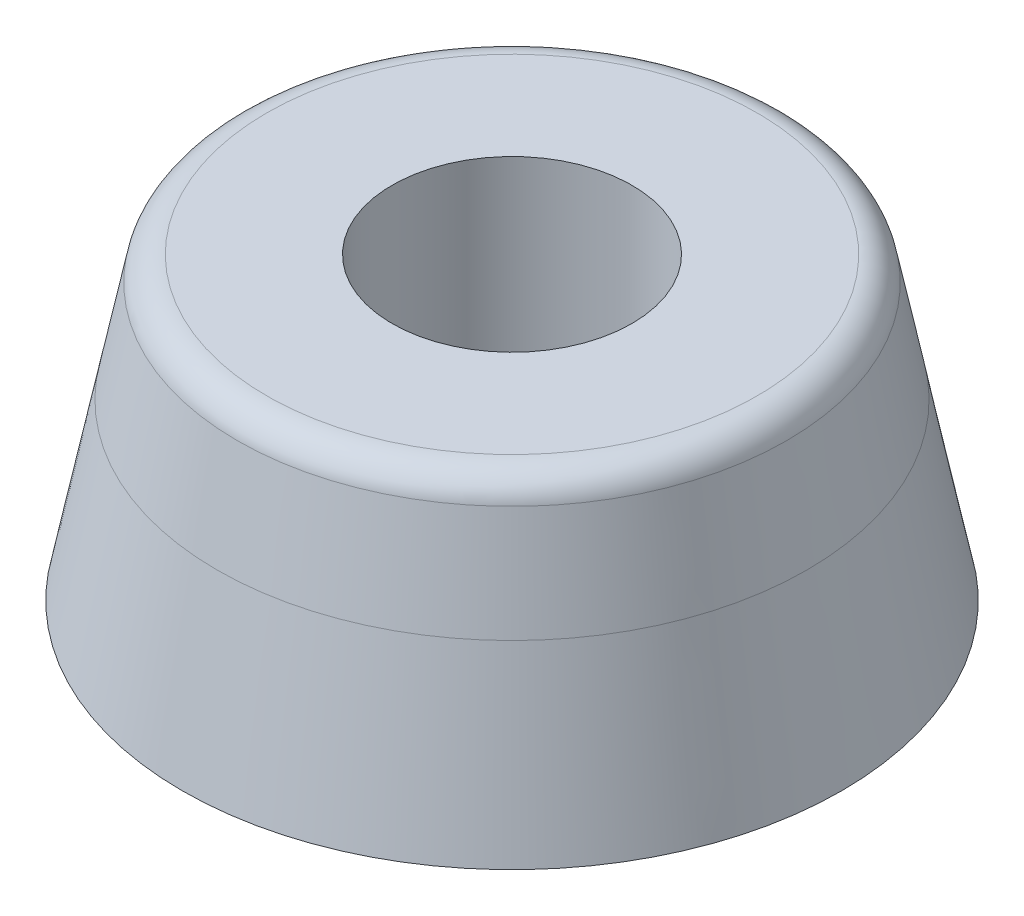
ISO-10303-21;
HEADER;
FILE_DESCRIPTION(('STEP AP214'),'2;1');
FILE_NAME('part.step','',(''),(''),'','','');
FILE_SCHEMA(('AUTOMOTIVE_DESIGN { 1 0 10303 214 1 1 1 1 }'));
ENDSEC;
DATA;
#1=APPLICATION_CONTEXT('core data for automotive mechanical design processes');
#2=APPLICATION_PROTOCOL_DEFINITION('international standard','automotive_design',2000,#1);
#3=PRODUCT_CONTEXT('',#1,'mechanical');
#4=PRODUCT('Part','Part','',(#3));
#5=PRODUCT_RELATED_PRODUCT_CATEGORY('part','',(#4));
#6=PRODUCT_DEFINITION_FORMATION('','',#4);
#7=PRODUCT_DEFINITION_CONTEXT('part definition',#1,'design');
#8=PRODUCT_DEFINITION('design','',#6,#7);
#9=PRODUCT_DEFINITION_SHAPE('','',#8);
#10=(LENGTH_UNIT() NAMED_UNIT(*) SI_UNIT(.MILLI.,.METRE.));
#11=(NAMED_UNIT(*) PLANE_ANGLE_UNIT() SI_UNIT($,.RADIAN.));
#12=(NAMED_UNIT(*) SI_UNIT($,.STERADIAN.) SOLID_ANGLE_UNIT());
#13=UNCERTAINTY_MEASURE_WITH_UNIT(LENGTH_MEASURE(1.E-05),#10,'distance_accuracy_value','');
#14=(GEOMETRIC_REPRESENTATION_CONTEXT(3) GLOBAL_UNCERTAINTY_ASSIGNED_CONTEXT((#13)) GLOBAL_UNIT_ASSIGNED_CONTEXT((#10,
#11,#12)) REPRESENTATION_CONTEXT('',''));
#15=CARTESIAN_POINT('',(0.,0.,0.));
#16=DIRECTION('',(0.,0.,1.));
#17=DIRECTION('',(1.,0.,0.));
#18=AXIS2_PLACEMENT_3D('',#15,#16,#17);
#19=CARTESIAN_POINT('',(0.,0.,0.));
#20=DIRECTION('',(0.,-1.,0.));
#21=DIRECTION('',(1.,0.,0.));
#22=AXIS2_PLACEMENT_3D('',#19,#20,#21);
#23=CONICAL_SURFACE('',#22,11.,0.197395559849877);
#24=CARTESIAN_POINT('',(0.,0.,0.));
#25=DIRECTION('',(0.,-1.,0.));
#26=DIRECTION('',(1.,0.,0.));
#27=AXIS2_PLACEMENT_3D('',#24,#25,#26);
#28=CIRCLE('',#27,11.);
#29=CARTESIAN_POINT('',(11.,0.,0.));
#30=VERTEX_POINT('',#29);
#31=EDGE_CURVE('E71',#30,#30,#28,.T.);
#32=ORIENTED_EDGE('',*,*,#31,.F.);
#33=EDGE_LOOP('',(#32));
#34=FACE_BOUND('',#33,.T.);
#35=CARTESIAN_POINT('',(0.,5.8,0.));
#36=DIRECTION('',(0.,1.,0.));
#37=DIRECTION('',(0.,0.,1.));
#38=AXIS2_PLACEMENT_3D('',#35,#36,#37);
#39=CIRCLE('',#38,9.84000000000001);
#40=CARTESIAN_POINT('',(0.,5.8,9.84));
#41=VERTEX_POINT('',#40);
#42=EDGE_CURVE('E10',#41,#41,#39,.F.);
#43=ORIENTED_EDGE('',*,*,#42,.T.);
#44=EDGE_LOOP('',(#43));
#45=FACE_BOUND('',#44,.T.);
#46=ADVANCED_FACE('F39',(#34,#45),#23,.T.);
#47=CARTESIAN_POINT('',(11.,0.,0.));
#48=DIRECTION('',(0.,-1.,0.));
#49=DIRECTION('',(1.,0.,0.));
#50=AXIS2_PLACEMENT_3D('',#47,#48,#49);
#51=PLANE('',#50);
#52=ORIENTED_EDGE('',*,*,#31,.T.);
#53=EDGE_LOOP('',(#52));
#54=FACE_BOUND('',#53,.T.);
#55=CARTESIAN_POINT('',(0.,0.,0.));
#56=DIRECTION('',(0.,-1.,0.));
#57=DIRECTION('',(1.,0.,0.));
#58=AXIS2_PLACEMENT_3D('',#55,#56,#57);
#59=CIRCLE('',#58,1.65);
#60=CARTESIAN_POINT('',(1.65,0.,0.));
#61=VERTEX_POINT('',#60);
#62=EDGE_CURVE('E57',#61,#61,#59,.T.);
#63=ORIENTED_EDGE('',*,*,#62,.F.);
#64=EDGE_LOOP('',(#63));
#65=FACE_BOUND('',#64,.T.);
#66=ADVANCED_FACE('F75',(#54,#65),#51,.T.);
#67=CARTESIAN_POINT('',(0.,0.,0.));
#68=DIRECTION('',(0.,-1.,0.));
#69=DIRECTION('',(1.,0.,0.));
#70=AXIS2_PLACEMENT_3D('',#67,#68,#69);
#71=CYLINDRICAL_SURFACE('',#70,1.65000000000001);
#72=ORIENTED_EDGE('',*,*,#62,.T.);
#73=EDGE_LOOP('',(#72));
#74=FACE_BOUND('',#73,.T.);
#75=CARTESIAN_POINT('',(0.,3.99999999999999,0.));
#76=DIRECTION('',(0.,-1.,0.));
#77=DIRECTION('',(1.,0.,0.));
#78=AXIS2_PLACEMENT_3D('',#75,#76,#77);
#79=CIRCLE('',#78,1.65000000000001);
#80=CARTESIAN_POINT('',(1.65,4.,0.));
#81=VERTEX_POINT('',#80);
#82=EDGE_CURVE('E62',#81,#81,#79,.T.);
#83=ORIENTED_EDGE('',*,*,#82,.F.);
#84=EDGE_LOOP('',(#83));
#85=FACE_BOUND('',#84,.T.);
#86=ADVANCED_FACE('F84',(#74,#85),#71,.F.);
#87=CARTESIAN_POINT('',(4.,4.,0.));
#88=DIRECTION('',(0.,1.,0.));
#89=DIRECTION('',(-1.,0.,0.));
#90=AXIS2_PLACEMENT_3D('',#87,#88,#89);
#91=PLANE('',#90);
#92=ORIENTED_EDGE('',*,*,#82,.T.);
#93=EDGE_LOOP('',(#92));
#94=FACE_BOUND('',#93,.T.);
#95=CARTESIAN_POINT('',(0.,3.99999999999999,0.));
#96=DIRECTION('',(0.,-1.,0.));
#97=DIRECTION('',(1.,0.,0.));
#98=AXIS2_PLACEMENT_3D('',#95,#96,#97);
#99=CIRCLE('',#98,4.00000000000002);
#100=CARTESIAN_POINT('',(4.,4.,0.));
#101=VERTEX_POINT('',#100);
#102=EDGE_CURVE('E65',#101,#101,#99,.T.);
#103=ORIENTED_EDGE('',*,*,#102,.F.);
#104=EDGE_LOOP('',(#103));
#105=FACE_BOUND('',#104,.T.);
#106=ADVANCED_FACE('F101',(#94,#105),#91,.T.);
#107=CARTESIAN_POINT('',(0.,0.,0.));
#108=DIRECTION('',(0.,-1.,0.));
#109=DIRECTION('',(1.,0.,0.));
#110=AXIS2_PLACEMENT_3D('',#107,#108,#109);
#111=CYLINDRICAL_SURFACE('',#110,4.00000000000002);
#112=ORIENTED_EDGE('',*,*,#102,.T.);
#113=EDGE_LOOP('',(#112));
#114=FACE_BOUND('',#113,.T.);
#115=CARTESIAN_POINT('',(0.,9.99999999999998,0.));
#116=DIRECTION('',(0.,-1.,0.));
#117=DIRECTION('',(1.,0.,0.));
#118=AXIS2_PLACEMENT_3D('',#115,#116,#117);
#119=CIRCLE('',#118,4.00000000000003);
#120=CARTESIAN_POINT('',(4.,10.,0.));
#121=VERTEX_POINT('',#120);
#122=EDGE_CURVE('E68',#121,#121,#119,.T.);
#123=ORIENTED_EDGE('',*,*,#122,.F.);
#124=EDGE_LOOP('',(#123));
#125=FACE_BOUND('',#124,.T.);
#126=ADVANCED_FACE('F94',(#114,#125),#111,.F.);
#127=CARTESIAN_POINT('',(4.,9.99999999999999,0.));
#128=DIRECTION('',(0.,1.,0.));
#129=DIRECTION('',(-1.,0.,0.));
#130=AXIS2_PLACEMENT_3D('',#127,#128,#129);
#131=PLANE('',#130);
#132=CARTESIAN_POINT('',(0.,9.99999999999998,0.));
#133=DIRECTION('',(0.,1.,0.));
#134=DIRECTION('',(-1.,0.,0.));
#135=AXIS2_PLACEMENT_3D('',#132,#133,#134);
#136=CIRCLE('',#135,8.18019609728147);
#137=CARTESIAN_POINT('',(-8.18019609728151,9.99999999999995,0.));
#138=VERTEX_POINT('',#137);
#139=EDGE_CURVE('E47',#138,#138,#136,.T.);
#140=ORIENTED_EDGE('',*,*,#139,.T.);
#141=EDGE_LOOP('',(#140));
#142=FACE_BOUND('',#141,.T.);
#143=ORIENTED_EDGE('',*,*,#122,.T.);
#144=EDGE_LOOP('',(#143));
#145=FACE_BOUND('',#144,.T.);
#146=ADVANCED_FACE('F87',(#142,#145),#131,.T.);
#147=ORIENTED_EDGE('',*,*,#42,.F.);
#148=EDGE_LOOP('',(#147));
#149=FACE_BOUND('',#148,.T.);
#150=CARTESIAN_POINT('',(0.,9.19611613513815,0.));
#151=DIRECTION('',(0.,1.,0.));
#152=DIRECTION('',(-1.,0.,0.));
#153=AXIS2_PLACEMENT_3D('',#150,#151,#152);
#154=CIRCLE('',#153,9.16077677297239);
#155=CARTESIAN_POINT('',(-9.16077677297243,9.19611613513812,0.));
#156=VERTEX_POINT('',#155);
#157=EDGE_CURVE('E53',#156,#156,#154,.F.);
#158=ORIENTED_EDGE('',*,*,#157,.T.);
#159=EDGE_LOOP('',(#158));
#160=FACE_BOUND('',#159,.T.);
#161=ADVANCED_FACE('F80',(#149,#160),#23,.T.);
#162=CARTESIAN_POINT('',(0.,8.99999999999998,0.));
#163=DIRECTION('',(0.,1.,0.));
#164=DIRECTION('',(-1.,0.,0.));
#165=AXIS2_PLACEMENT_3D('',#162,#163,#164);
#166=TOROIDAL_SURFACE('',#165,8.18019609728147,1.);
#167=ORIENTED_EDGE('',*,*,#139,.F.);
#168=EDGE_LOOP('',(#167));
#169=FACE_BOUND('',#168,.T.);
#170=ORIENTED_EDGE('',*,*,#157,.F.);
#171=EDGE_LOOP('',(#170));
#172=FACE_BOUND('',#171,.T.);
#173=ADVANCED_FACE('F41',(#169,#172),#166,.T.);
#174=CLOSED_SHELL('',(#46,#66,#86,#106,#126,#146,#161,#173));
#175=MANIFOLD_SOLID_BREP('B2',#174);
#176=ADVANCED_BREP_SHAPE_REPRESENTATION('',(#18,#175),#14);
#177=SHAPE_DEFINITION_REPRESENTATION(#9,#176);
ENDSEC;
END-ISO-10303-21;
